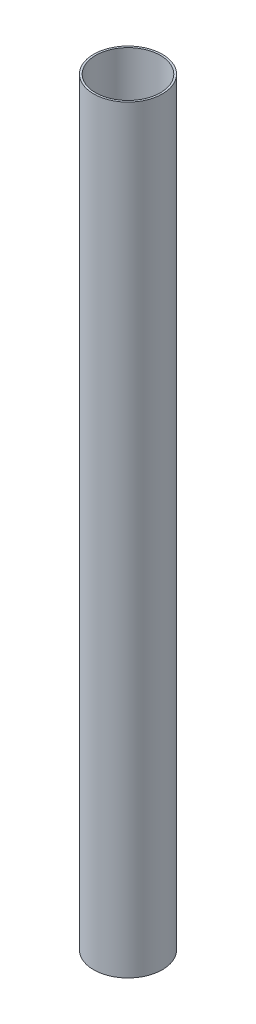
ISO-10303-21;
HEADER;
FILE_DESCRIPTION(('STEP AP214'),'2;1');
FILE_NAME('part.step','',(''),(''),'','','');
FILE_SCHEMA(('AUTOMOTIVE_DESIGN { 1 0 10303 214 1 1 1 1 }'));
ENDSEC;
DATA;
#1=APPLICATION_CONTEXT('core data for automotive mechanical design processes');
#2=APPLICATION_PROTOCOL_DEFINITION('international standard','automotive_design',2000,#1);
#3=PRODUCT_CONTEXT('',#1,'mechanical');
#4=PRODUCT('Part','Part','',(#3));
#5=PRODUCT_RELATED_PRODUCT_CATEGORY('part','',(#4));
#6=PRODUCT_DEFINITION_FORMATION('','',#4);
#7=PRODUCT_DEFINITION_CONTEXT('part definition',#1,'design');
#8=PRODUCT_DEFINITION('design','',#6,#7);
#9=PRODUCT_DEFINITION_SHAPE('','',#8);
#10=(LENGTH_UNIT() NAMED_UNIT(*) SI_UNIT(.MILLI.,.METRE.));
#11=(NAMED_UNIT(*) PLANE_ANGLE_UNIT() SI_UNIT($,.RADIAN.));
#12=(NAMED_UNIT(*) SI_UNIT($,.STERADIAN.) SOLID_ANGLE_UNIT());
#13=UNCERTAINTY_MEASURE_WITH_UNIT(LENGTH_MEASURE(1.E-05),#10,'distance_accuracy_value','');
#14=(GEOMETRIC_REPRESENTATION_CONTEXT(3) GLOBAL_UNCERTAINTY_ASSIGNED_CONTEXT((#13)) GLOBAL_UNIT_ASSIGNED_CONTEXT((#10,
#11,#12)) REPRESENTATION_CONTEXT('',''));
#15=CARTESIAN_POINT('',(0.,0.,0.));
#16=DIRECTION('',(0.,0.,1.));
#17=DIRECTION('',(1.,0.,0.));
#18=AXIS2_PLACEMENT_3D('',#15,#16,#17);
#19=CARTESIAN_POINT('',(0.,595.7316,0.));
#20=DIRECTION('',(0.,1.,0.));
#21=DIRECTION('',(0.,0.,1.));
#22=AXIS2_PLACEMENT_3D('',#19,#20,#21);
#23=PLANE('',#22);
#24=CARTESIAN_POINT('',(0.,595.7316,0.));
#25=DIRECTION('',(0.,1.,0.));
#26=DIRECTION('',(0.,0.,1.));
#27=AXIS2_PLACEMENT_3D('',#24,#25,#26);
#28=CIRCLE('',#27,26.9875);
#29=CARTESIAN_POINT('',(0.,595.7316,26.9875));
#30=VERTEX_POINT('',#29);
#31=EDGE_CURVE('E10',#30,#30,#28,.T.);
#32=ORIENTED_EDGE('',*,*,#31,.T.);
#33=EDGE_LOOP('',(#32));
#34=FACE_BOUND('',#33,.T.);
#35=CARTESIAN_POINT('',(0.,595.7316,0.));
#36=DIRECTION('',(0.,1.,0.));
#37=DIRECTION('',(0.,0.,1.));
#38=AXIS2_PLACEMENT_3D('',#35,#36,#37);
#39=CIRCLE('',#38,25.4635);
#40=CARTESIAN_POINT('',(0.,595.7316,25.4635));
#41=VERTEX_POINT('',#40);
#42=EDGE_CURVE('E56',#41,#41,#39,.T.);
#43=ORIENTED_EDGE('',*,*,#42,.F.);
#44=EDGE_LOOP('',(#43));
#45=FACE_BOUND('',#44,.T.);
#46=ADVANCED_FACE('F43',(#34,#45),#23,.T.);
#47=CARTESIAN_POINT('',(0.,0.,0.));
#48=DIRECTION('',(0.,1.,0.));
#49=DIRECTION('',(0.,0.,1.));
#50=AXIS2_PLACEMENT_3D('',#47,#48,#49);
#51=PLANE('',#50);
#52=CARTESIAN_POINT('',(0.,0.,0.));
#53=DIRECTION('',(0.,1.,0.));
#54=DIRECTION('',(0.,0.,1.));
#55=AXIS2_PLACEMENT_3D('',#52,#53,#54);
#56=CIRCLE('',#55,26.9875);
#57=CARTESIAN_POINT('',(0.,0.,26.9875));
#58=VERTEX_POINT('',#57);
#59=EDGE_CURVE('E47',#58,#58,#56,.T.);
#60=ORIENTED_EDGE('',*,*,#59,.F.);
#61=EDGE_LOOP('',(#60));
#62=FACE_BOUND('',#61,.T.);
#63=CARTESIAN_POINT('',(0.,0.,0.));
#64=DIRECTION('',(0.,1.,0.));
#65=DIRECTION('',(0.,0.,1.));
#66=AXIS2_PLACEMENT_3D('',#63,#64,#65);
#67=CIRCLE('',#66,25.4635);
#68=CARTESIAN_POINT('',(0.,0.,25.4635));
#69=VERTEX_POINT('',#68);
#70=EDGE_CURVE('E58',#69,#69,#67,.T.);
#71=ORIENTED_EDGE('',*,*,#70,.T.);
#72=EDGE_LOOP('',(#71));
#73=FACE_BOUND('',#72,.T.);
#74=ADVANCED_FACE('F70',(#62,#73),#51,.F.);
#75=CARTESIAN_POINT('',(0.,595.7316,0.));
#76=DIRECTION('',(0.,-1.,0.));
#77=DIRECTION('',(0.,0.,-1.));
#78=AXIS2_PLACEMENT_3D('',#75,#76,#77);
#79=CYLINDRICAL_SURFACE('',#78,26.9875);
#80=ORIENTED_EDGE('',*,*,#31,.F.);
#81=EDGE_LOOP('',(#80));
#82=FACE_BOUND('',#81,.T.);
#83=ORIENTED_EDGE('',*,*,#59,.T.);
#84=EDGE_LOOP('',(#83));
#85=FACE_BOUND('',#84,.T.);
#86=ADVANCED_FACE('F45',(#82,#85),#79,.T.);
#87=CARTESIAN_POINT('',(0.,595.7316,0.));
#88=DIRECTION('',(0.,-1.,0.));
#89=DIRECTION('',(0.,0.,-1.));
#90=AXIS2_PLACEMENT_3D('',#87,#88,#89);
#91=CYLINDRICAL_SURFACE('',#90,25.4635);
#92=ORIENTED_EDGE('',*,*,#42,.T.);
#93=EDGE_LOOP('',(#92));
#94=FACE_BOUND('',#93,.T.);
#95=ORIENTED_EDGE('',*,*,#70,.F.);
#96=EDGE_LOOP('',(#95));
#97=FACE_BOUND('',#96,.T.);
#98=ADVANCED_FACE('F66',(#94,#97),#91,.F.);
#99=CLOSED_SHELL('',(#46,#74,#86,#98));
#100=MANIFOLD_SOLID_BREP('B2',#99);
#101=ADVANCED_BREP_SHAPE_REPRESENTATION('',(#18,#100),#14);
#102=SHAPE_DEFINITION_REPRESENTATION(#9,#101);
ENDSEC;
END-ISO-10303-21;
